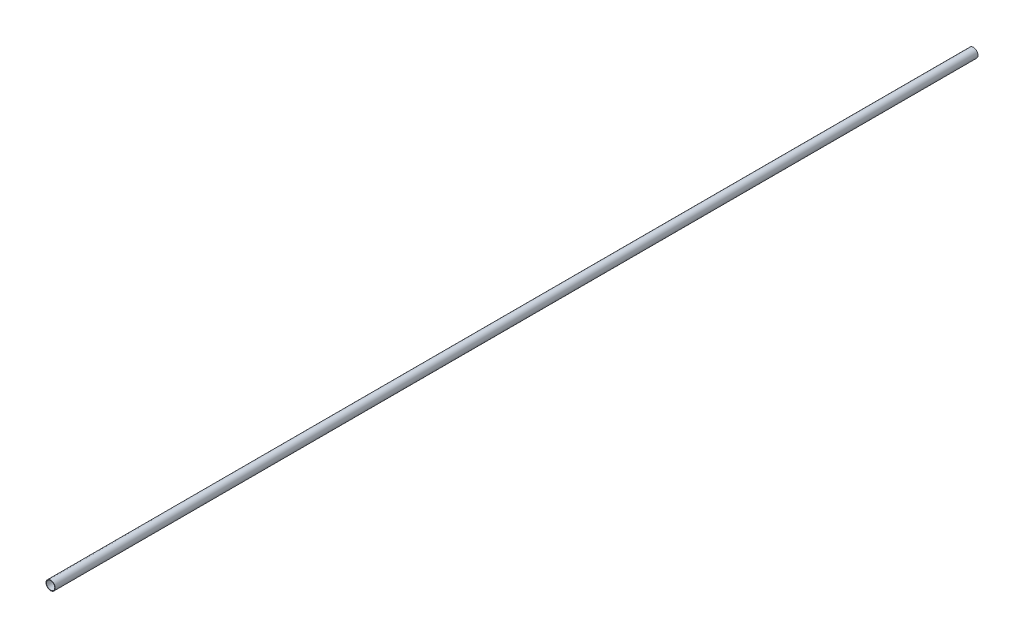
ISO-10303-21;
HEADER;
FILE_DESCRIPTION(('STEP AP214'),'2;1');
FILE_NAME('part.step','',(''),(''),'','','');
FILE_SCHEMA(('AUTOMOTIVE_DESIGN { 1 0 10303 214 1 1 1 1 }'));
ENDSEC;
DATA;
#1=APPLICATION_CONTEXT('core data for automotive mechanical design processes');
#2=APPLICATION_PROTOCOL_DEFINITION('international standard','automotive_design',2000,#1);
#3=PRODUCT_CONTEXT('',#1,'mechanical');
#4=PRODUCT('Part','Part','',(#3));
#5=PRODUCT_RELATED_PRODUCT_CATEGORY('part','',(#4));
#6=PRODUCT_DEFINITION_FORMATION('','',#4);
#7=PRODUCT_DEFINITION_CONTEXT('part definition',#1,'design');
#8=PRODUCT_DEFINITION('design','',#6,#7);
#9=PRODUCT_DEFINITION_SHAPE('','',#8);
#10=(LENGTH_UNIT() NAMED_UNIT(*) SI_UNIT(.MILLI.,.METRE.));
#11=(NAMED_UNIT(*) PLANE_ANGLE_UNIT() SI_UNIT($,.RADIAN.));
#12=(NAMED_UNIT(*) SI_UNIT($,.STERADIAN.) SOLID_ANGLE_UNIT());
#13=UNCERTAINTY_MEASURE_WITH_UNIT(LENGTH_MEASURE(1.E-05),#10,'distance_accuracy_value','');
#14=(GEOMETRIC_REPRESENTATION_CONTEXT(3) GLOBAL_UNCERTAINTY_ASSIGNED_CONTEXT((#13)) GLOBAL_UNIT_ASSIGNED_CONTEXT((#10,
#11,#12)) REPRESENTATION_CONTEXT('',''));
#15=CARTESIAN_POINT('',(0.,0.,0.));
#16=DIRECTION('',(0.,0.,1.));
#17=DIRECTION('',(1.,0.,0.));
#18=AXIS2_PLACEMENT_3D('',#15,#16,#17);
#19=CARTESIAN_POINT('',(0.,0.,1000.));
#20=DIRECTION('',(0.,0.,-1.));
#21=DIRECTION('',(-1.,0.,0.));
#22=AXIS2_PLACEMENT_3D('',#19,#20,#21);
#23=CYLINDRICAL_SURFACE('',#22,5.);
#24=CARTESIAN_POINT('',(0.,0.,1000.));
#25=DIRECTION('',(0.,0.,1.));
#26=DIRECTION('',(1.,0.,0.));
#27=AXIS2_PLACEMENT_3D('',#24,#25,#26);
#28=CIRCLE('',#27,5.);
#29=CARTESIAN_POINT('',(5.,0.,1000.));
#30=VERTEX_POINT('',#29);
#31=EDGE_CURVE('E10',#30,#30,#28,.T.);
#32=ORIENTED_EDGE('',*,*,#31,.F.);
#33=EDGE_LOOP('',(#32));
#34=FACE_BOUND('',#33,.T.);
#35=CARTESIAN_POINT('',(0.,0.,0.));
#36=DIRECTION('',(0.,0.,1.));
#37=DIRECTION('',(1.,0.,0.));
#38=AXIS2_PLACEMENT_3D('',#35,#36,#37);
#39=CIRCLE('',#38,5.);
#40=CARTESIAN_POINT('',(5.,0.,0.));
#41=VERTEX_POINT('',#40);
#42=EDGE_CURVE('E40',#41,#41,#39,.T.);
#43=ORIENTED_EDGE('',*,*,#42,.T.);
#44=EDGE_LOOP('',(#43));
#45=FACE_BOUND('',#44,.T.);
#46=ADVANCED_FACE('F37',(#34,#45),#23,.T.);
#47=CARTESIAN_POINT('',(0.,0.,1000.));
#48=DIRECTION('',(0.,0.,1.));
#49=DIRECTION('',(1.,0.,0.));
#50=AXIS2_PLACEMENT_3D('',#47,#48,#49);
#51=PLANE('',#50);
#52=CARTESIAN_POINT('',(0.,0.,1000.));
#53=DIRECTION('',(0.,0.,1.));
#54=DIRECTION('',(1.,0.,0.));
#55=AXIS2_PLACEMENT_3D('',#52,#53,#54);
#56=CIRCLE('',#55,4.5);
#57=CARTESIAN_POINT('',(4.5,0.,1000.));
#58=VERTEX_POINT('',#57);
#59=EDGE_CURVE('E51',#58,#58,#56,.T.);
#60=ORIENTED_EDGE('',*,*,#59,.F.);
#61=EDGE_LOOP('',(#60));
#62=FACE_BOUND('',#61,.T.);
#63=ORIENTED_EDGE('',*,*,#31,.T.);
#64=EDGE_LOOP('',(#63));
#65=FACE_BOUND('',#64,.T.);
#66=ADVANCED_FACE('F68',(#62,#65),#51,.T.);
#67=CARTESIAN_POINT('',(0.,0.,0.));
#68=DIRECTION('',(0.,0.,1.));
#69=DIRECTION('',(1.,0.,0.));
#70=AXIS2_PLACEMENT_3D('',#67,#68,#69);
#71=PLANE('',#70);
#72=CARTESIAN_POINT('',(0.,0.,0.));
#73=DIRECTION('',(0.,0.,1.));
#74=DIRECTION('',(1.,0.,0.));
#75=AXIS2_PLACEMENT_3D('',#72,#73,#74);
#76=CIRCLE('',#75,4.5);
#77=CARTESIAN_POINT('',(4.5,0.,0.));
#78=VERTEX_POINT('',#77);
#79=EDGE_CURVE('E49',#78,#78,#76,.T.);
#80=ORIENTED_EDGE('',*,*,#79,.T.);
#81=EDGE_LOOP('',(#80));
#82=FACE_BOUND('',#81,.T.);
#83=ORIENTED_EDGE('',*,*,#42,.F.);
#84=EDGE_LOOP('',(#83));
#85=FACE_BOUND('',#84,.T.);
#86=ADVANCED_FACE('F59',(#82,#85),#71,.F.);
#87=CARTESIAN_POINT('',(0.,0.,0.));
#88=DIRECTION('',(0.,0.,1.));
#89=DIRECTION('',(1.,0.,0.));
#90=AXIS2_PLACEMENT_3D('',#87,#88,#89);
#91=CYLINDRICAL_SURFACE('',#90,4.5);
#92=ORIENTED_EDGE('',*,*,#79,.F.);
#93=EDGE_LOOP('',(#92));
#94=FACE_BOUND('',#93,.T.);
#95=ORIENTED_EDGE('',*,*,#59,.T.);
#96=EDGE_LOOP('',(#95));
#97=FACE_BOUND('',#96,.T.);
#98=ADVANCED_FACE('F62',(#94,#97),#91,.F.);
#99=CLOSED_SHELL('',(#46,#66,#86,#98));
#100=MANIFOLD_SOLID_BREP('B2',#99);
#101=ADVANCED_BREP_SHAPE_REPRESENTATION('',(#18,#100),#14);
#102=SHAPE_DEFINITION_REPRESENTATION(#9,#101);
ENDSEC;
END-ISO-10303-21;
